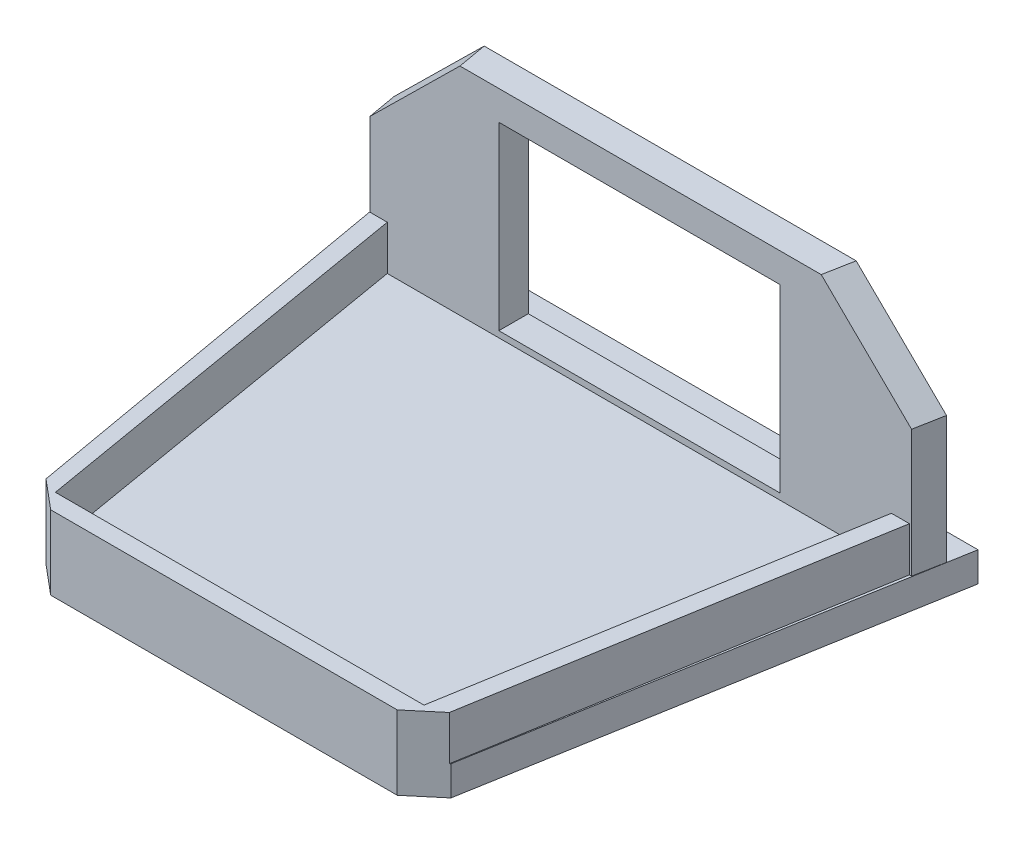
ISO-10303-21;
HEADER;
FILE_DESCRIPTION(('STEP AP214'),'2;1');
FILE_NAME('part.step','',(''),(''),'','','');
FILE_SCHEMA(('AUTOMOTIVE_DESIGN { 1 0 10303 214 1 1 1 1 }'));
ENDSEC;
DATA;
#1=APPLICATION_CONTEXT('core data for automotive mechanical design processes');
#2=APPLICATION_PROTOCOL_DEFINITION('international standard','automotive_design',2000,#1);
#3=PRODUCT_CONTEXT('',#1,'mechanical');
#4=PRODUCT('Part','Part','',(#3));
#5=PRODUCT_RELATED_PRODUCT_CATEGORY('part','',(#4));
#6=PRODUCT_DEFINITION_FORMATION('','',#4);
#7=PRODUCT_DEFINITION_CONTEXT('part definition',#1,'design');
#8=PRODUCT_DEFINITION('design','',#6,#7);
#9=PRODUCT_DEFINITION_SHAPE('','',#8);
#10=(LENGTH_UNIT() NAMED_UNIT(*) SI_UNIT(.MILLI.,.METRE.));
#11=(NAMED_UNIT(*) PLANE_ANGLE_UNIT() SI_UNIT($,.RADIAN.));
#12=(NAMED_UNIT(*) SI_UNIT($,.STERADIAN.) SOLID_ANGLE_UNIT());
#13=UNCERTAINTY_MEASURE_WITH_UNIT(LENGTH_MEASURE(1.E-05),#10,'distance_accuracy_value','');
#14=(GEOMETRIC_REPRESENTATION_CONTEXT(3) GLOBAL_UNCERTAINTY_ASSIGNED_CONTEXT((#13)) GLOBAL_UNIT_ASSIGNED_CONTEXT((#10,
#11,#12)) REPRESENTATION_CONTEXT('',''));
#15=CARTESIAN_POINT('',(0.,0.,0.));
#16=DIRECTION('',(0.,0.,1.));
#17=DIRECTION('',(1.,0.,0.));
#18=AXIS2_PLACEMENT_3D('',#15,#16,#17);
#19=CARTESIAN_POINT('',(-68.2447643049953,10.,151.736481776669));
#20=DIRECTION('',(0.642787609686541,0.,-0.766044443118976));
#21=DIRECTION('',(0.,1.,0.));
#22=AXIS2_PLACEMENT_3D('',#19,#20,#21);
#23=PLANE('',#22);
#24=DIRECTION('',(0.,1.,0.));
#25=VECTOR('',#24,1.);
#26=CARTESIAN_POINT('',(-68.2447643049953,10.,151.736481776669));
#27=LINE('',#26,#25);
#28=CARTESIAN_POINT('',(-68.2447643049953,0.,151.736481776669));
#29=VERTEX_POINT('',#28);
#30=CARTESIAN_POINT('',(-68.2447643049953,25.,151.736481776669));
#31=VERTEX_POINT('',#30);
#32=EDGE_CURVE('E381',#29,#31,#27,.T.);
#33=ORIENTED_EDGE('',*,*,#32,.F.);
#34=DIRECTION('',(0.766044443118977,0.,0.642787609686541));
#35=VECTOR('',#34,1.);
#36=CARTESIAN_POINT('',(-68.2447643049953,0.,151.736481776669));
#37=LINE('',#36,#35);
#38=CARTESIAN_POINT('',(-58.3966867748732,0.,160.));
#39=VERTEX_POINT('',#38);
#40=EDGE_CURVE('E90',#39,#29,#37,.F.);
#41=ORIENTED_EDGE('',*,*,#40,.F.);
#42=DIRECTION('',(0.,-1.,0.));
#43=VECTOR('',#42,1.);
#44=CARTESIAN_POINT('',(-58.3966867748732,10.,160.));
#45=LINE('',#44,#43);
#46=CARTESIAN_POINT('',(-58.3966867748732,25.,160.));
#47=VERTEX_POINT('',#46);
#48=EDGE_CURVE('E384',#47,#39,#45,.T.);
#49=ORIENTED_EDGE('',*,*,#48,.F.);
#50=DIRECTION('',(-0.766044443118977,0.,-0.642787609686541));
#51=VECTOR('',#50,1.);
#52=CARTESIAN_POINT('',(-68.2447643049953,25.,151.736481776669));
#53=LINE('',#52,#51);
#54=EDGE_CURVE('E14',#31,#47,#53,.F.);
#55=ORIENTED_EDGE('',*,*,#54,.F.);
#56=EDGE_LOOP('',(#33,#41,#49,#55));
#57=FACE_BOUND('',#56,.T.);
#58=ADVANCED_FACE('F82',(#57),#23,.F.);
#59=CARTESIAN_POINT('',(68.5777364082518,10.,151.715738587815));
#60=DIRECTION('',(-0.643593870860535,0.,-0.765367185990327));
#61=DIRECTION('',(0.,-1.,0.));
#62=AXIS2_PLACEMENT_3D('',#59,#60,#61);
#63=PLANE('',#62);
#64=DIRECTION('',(0.,-1.,0.));
#65=VECTOR('',#64,1.);
#66=CARTESIAN_POINT('',(68.5777364082518,10.,151.715738587815));
#67=LINE('',#66,#65);
#68=CARTESIAN_POINT('',(68.5777364082518,10.,151.715738587815));
#69=VERTEX_POINT('',#68);
#70=CARTESIAN_POINT('',(68.5777364082518,0.,151.715738587815));
#71=VERTEX_POINT('',#70);
#72=EDGE_CURVE('E364',#69,#71,#67,.T.);
#73=ORIENTED_EDGE('',*,*,#72,.F.);
#74=DIRECTION('',(-0.765367185990328,0.,0.643593870860535));
#75=VECTOR('',#74,1.);
#76=CARTESIAN_POINT('',(103.138787425222,10.,122.653504130717));
#77=LINE('',#76,#75);
#78=CARTESIAN_POINT('',(68.2903963516016,10.,151.95736156656));
#79=VERTEX_POINT('',#78);
#80=EDGE_CURVE('E376',#79,#69,#77,.F.);
#81=ORIENTED_EDGE('',*,*,#80,.F.);
#82=DIRECTION('',(0.,1.,0.));
#83=VECTOR('',#82,1.);
#84=CARTESIAN_POINT('',(68.2903963516016,25.,151.95736156656));
#85=LINE('',#84,#83);
#86=CARTESIAN_POINT('',(68.2903963516016,25.,151.95736156656));
#87=VERTEX_POINT('',#86);
#88=EDGE_CURVE('E373',#87,#79,#85,.F.);
#89=ORIENTED_EDGE('',*,*,#88,.F.);
#90=DIRECTION('',(-0.765367185990328,0.,0.643593870860535));
#91=VECTOR('',#90,1.);
#92=CARTESIAN_POINT('',(68.5777364082518,25.,151.715738587815));
#93=LINE('',#92,#91);
#94=CARTESIAN_POINT('',(58.7260238110288,25.,160.));
#95=VERTEX_POINT('',#94);
#96=EDGE_CURVE('E370',#95,#87,#93,.F.);
#97=ORIENTED_EDGE('',*,*,#96,.F.);
#98=DIRECTION('',(0.,1.,0.));
#99=VECTOR('',#98,1.);
#100=CARTESIAN_POINT('',(58.7260238110288,10.,160.));
#101=LINE('',#100,#99);
#102=CARTESIAN_POINT('',(58.7260238110288,0.,160.));
#103=VERTEX_POINT('',#102);
#104=EDGE_CURVE('E367',#103,#95,#101,.T.);
#105=ORIENTED_EDGE('',*,*,#104,.F.);
#106=DIRECTION('',(0.765367185990328,0.,-0.643593870860535));
#107=VECTOR('',#106,1.);
#108=CARTESIAN_POINT('',(68.5777364082518,0.,151.715738587815));
#109=LINE('',#108,#107);
#110=EDGE_CURVE('E378',#71,#103,#109,.F.);
#111=ORIENTED_EDGE('',*,*,#110,.F.);
#112=EDGE_LOOP('',(#73,#81,#89,#97,#105,#111));
#113=FACE_BOUND('',#112,.T.);
#114=ADVANCED_FACE('F538',(#113),#63,.F.);
#115=CARTESIAN_POINT('',(0.,10.,0.));
#116=DIRECTION('',(0.,1.,0.));
#117=DIRECTION('',(0.,0.,1.));
#118=AXIS2_PLACEMENT_3D('',#115,#116,#117);
#119=PLANE('',#118);
#120=DIRECTION('',(0.,0.,1.));
#121=VECTOR('',#120,1.);
#122=CARTESIAN_POINT('',(-62.7317504692542,10.,154.));
#123=LINE('',#122,#121);
#124=CARTESIAN_POINT('',(-62.7317504692542,10.,154.));
#125=VERTEX_POINT('',#124);
#126=CARTESIAN_POINT('',(-62.7317504692542,10.,154.085266054807));
#127=VERTEX_POINT('',#126);
#128=EDGE_CURVE('E285',#125,#127,#123,.T.);
#129=ORIENTED_EDGE('',*,*,#128,.T.);
#130=DIRECTION('',(-1.,0.,0.));
#131=VECTOR('',#130,1.);
#132=CARTESIAN_POINT('',(0.,10.,154.085266054807));
#133=LINE('',#132,#131);
#134=CARTESIAN_POINT('',(61.8455102774302,10.,154.085266054807));
#135=VERTEX_POINT('',#134);
#136=EDGE_CURVE('E257',#135,#127,#133,.T.);
#137=ORIENTED_EDGE('',*,*,#136,.F.);
#138=DIRECTION('',(-0.166695453989016,0.,0.986008430805435));
#139=VECTOR('',#138,1.);
#140=CARTESIAN_POINT('',(85.5456875547142,10.,13.898032103453));
#141=LINE('',#140,#139);
#142=CARTESIAN_POINT('',(84.6909741974674,10.,18.9536863279701));
#143=VERTEX_POINT('',#142);
#144=EDGE_CURVE('E265',#143,#135,#141,.T.);
#145=ORIENTED_EDGE('',*,*,#144,.F.);
#146=DIRECTION('',(-1.,0.,0.));
#147=VECTOR('',#146,1.);
#148=CARTESIAN_POINT('',(91.5012770182299,10.,18.9536863279701));
#149=LINE('',#148,#147);
#150=CARTESIAN_POINT('',(-85.6827631120349,10.,18.9536863279701));
#151=VERTEX_POINT('',#150);
#152=EDGE_CURVE('E344',#143,#151,#149,.T.);
#153=ORIENTED_EDGE('',*,*,#152,.T.);
#154=DIRECTION('',(0.16754681621269,0.,0.985864120645939));
#155=VECTOR('',#154,1.);
#156=CARTESIAN_POINT('',(-86.3438606705436,10.,15.0637146895178));
#157=LINE('',#156,#155);
#158=EDGE_CURVE('E287',#151,#125,#157,.T.);
#159=ORIENTED_EDGE('',*,*,#158,.T.);
#160=EDGE_LOOP('',(#129,#137,#145,#153,#159));
#161=FACE_BOUND('',#160,.T.);
#162=ADVANCED_FACE('F554',(#161),#119,.T.);
#163=CARTESIAN_POINT('',(-62.7317504692542,25.,154.));
#164=DIRECTION('',(1.,0.,0.));
#165=DIRECTION('',(0.,0.,-1.));
#166=AXIS2_PLACEMENT_3D('',#163,#164,#165);
#167=PLANE('',#166);
#168=DIRECTION('',(0.,0.,1.));
#169=VECTOR('',#168,1.);
#170=CARTESIAN_POINT('',(-62.7317504692542,25.,154.));
#171=LINE('',#170,#169);
#172=CARTESIAN_POINT('',(-62.7317504692542,25.,154.));
#173=VERTEX_POINT('',#172);
#174=CARTESIAN_POINT('',(-62.7317504692542,25.,154.085266054807));
#175=VERTEX_POINT('',#174);
#176=EDGE_CURVE('E250',#173,#175,#171,.T.);
#177=ORIENTED_EDGE('',*,*,#176,.T.);
#178=DIRECTION('',(0.,-1.,0.));
#179=VECTOR('',#178,1.);
#180=CARTESIAN_POINT('',(-62.7317504692542,25.,154.085266054807));
#181=LINE('',#180,#179);
#182=EDGE_CURVE('E256',#175,#127,#181,.T.);
#183=ORIENTED_EDGE('',*,*,#182,.T.);
#184=ORIENTED_EDGE('',*,*,#128,.F.);
#185=DIRECTION('',(0.,-1.,0.));
#186=VECTOR('',#185,1.);
#187=CARTESIAN_POINT('',(-62.7317504692542,25.,154.));
#188=LINE('',#187,#186);
#189=EDGE_CURVE('E270',#173,#125,#188,.T.);
#190=ORIENTED_EDGE('',*,*,#189,.F.);
#191=EDGE_LOOP('',(#177,#183,#184,#190));
#192=FACE_BOUND('',#191,.T.);
#193=ADVANCED_FACE('F268',(#192),#167,.T.);
#194=CARTESIAN_POINT('',(85.5456875547142,25.,13.898032103453));
#195=DIRECTION('',(0.986008430805435,0.,0.166695453989016));
#196=DIRECTION('',(0.166695453989016,0.,-0.986008430805435));
#197=AXIS2_PLACEMENT_3D('',#194,#195,#196);
#198=PLANE('',#197);
#199=DIRECTION('',(0.,-1.,0.));
#200=VECTOR('',#199,1.);
#201=CARTESIAN_POINT('',(61.8455102774302,25.,154.085266054807));
#202=LINE('',#201,#200);
#203=CARTESIAN_POINT('',(61.8455102774302,25.,154.085266054807));
#204=VERTEX_POINT('',#203);
#205=EDGE_CURVE('E362',#204,#135,#202,.T.);
#206=ORIENTED_EDGE('',*,*,#205,.F.);
#207=DIRECTION('',(-0.166695453989016,0.,0.986008430805435));
#208=VECTOR('',#207,1.);
#209=CARTESIAN_POINT('',(85.5456875547142,25.,13.898032103453));
#210=LINE('',#209,#208);
#211=CARTESIAN_POINT('',(84.6909741974674,25.,18.9536863279701));
#212=VERTEX_POINT('',#211);
#213=EDGE_CURVE('E253',#212,#204,#210,.T.);
#214=ORIENTED_EDGE('',*,*,#213,.F.);
#215=DIRECTION('',(0.,-1.,0.));
#216=VECTOR('',#215,1.);
#217=CARTESIAN_POINT('',(84.6909741974674,10.,18.9536863279701));
#218=LINE('',#217,#216);
#219=EDGE_CURVE('E288',#212,#143,#218,.T.);
#220=ORIENTED_EDGE('',*,*,#219,.T.);
#221=ORIENTED_EDGE('',*,*,#144,.T.);
#222=EDGE_LOOP('',(#206,#214,#220,#221));
#223=FACE_BOUND('',#222,.T.);
#224=ADVANCED_FACE('F518',(#223),#198,.F.);
#225=CARTESIAN_POINT('',(91.5012770182299,10.,18.9536863279701));
#226=DIRECTION('',(0.,0.,-1.));
#227=DIRECTION('',(-1.,0.,0.));
#228=AXIS2_PLACEMENT_3D('',#225,#226,#227);
#229=PLANE('',#228);
#230=DIRECTION('',(-1.,0.,0.));
#231=VECTOR('',#230,1.);
#232=CARTESIAN_POINT('',(91.5012770182299,73.109439340653,18.9536863279701));
#233=LINE('',#232,#231);
#234=CARTESIAN_POINT('',(47.0304394550277,73.109439340653,18.9536863279701));
#235=VERTEX_POINT('',#234);
#236=CARTESIAN_POINT('',(-47.9695605449723,73.109439340653,18.9536863279701));
#237=VERTEX_POINT('',#236);
#238=EDGE_CURVE('E421',#235,#237,#233,.T.);
#239=ORIENTED_EDGE('',*,*,#238,.F.);
#240=DIRECTION('',(0.,-1.,0.));
#241=VECTOR('',#240,1.);
#242=CARTESIAN_POINT('',(47.0304394550277,10.,18.9536863279701));
#243=LINE('',#242,#241);
#244=CARTESIAN_POINT('',(47.0304394550277,12.109439340653,18.9536863279701));
#245=VERTEX_POINT('',#244);
#246=EDGE_CURVE('E412',#235,#245,#243,.T.);
#247=ORIENTED_EDGE('',*,*,#246,.T.);
#248=DIRECTION('',(1.,0.,0.));
#249=VECTOR('',#248,1.);
#250=CARTESIAN_POINT('',(91.5012770182299,12.109439340653,18.9536863279701));
#251=LINE('',#250,#249);
#252=CARTESIAN_POINT('',(-47.9695605449723,12.109439340653,18.9536863279701));
#253=VERTEX_POINT('',#252);
#254=EDGE_CURVE('E415',#253,#245,#251,.T.);
#255=ORIENTED_EDGE('',*,*,#254,.F.);
#256=DIRECTION('',(0.,1.,0.));
#257=VECTOR('',#256,1.);
#258=CARTESIAN_POINT('',(-47.9695605449723,10.,18.9536863279701));
#259=LINE('',#258,#257);
#260=EDGE_CURVE('E418',#253,#237,#259,.T.);
#261=ORIENTED_EDGE('',*,*,#260,.T.);
#262=EDGE_LOOP('',(#239,#247,#255,#261));
#263=FACE_BOUND('',#262,.T.);
#264=ORIENTED_EDGE('',*,*,#219,.F.);
#265=DIRECTION('',(-1.,0.,0.));
#266=VECTOR('',#265,1.);
#267=CARTESIAN_POINT('',(91.5012770182299,25.,18.9536863279701));
#268=LINE('',#267,#266);
#269=CARTESIAN_POINT('',(90.7761148641642,25.,18.9536863279701));
#270=VERTEX_POINT('',#269);
#271=EDGE_CURVE('E360',#270,#212,#268,.T.);
#272=ORIENTED_EDGE('',*,*,#271,.F.);
#273=DIRECTION('',(0.,-1.,0.));
#274=VECTOR('',#273,1.);
#275=CARTESIAN_POINT('',(90.7761148641642,10.,18.9536863279701));
#276=LINE('',#275,#274);
#277=CARTESIAN_POINT('',(90.7761148641642,10.,18.9536863279701));
#278=VERTEX_POINT('',#277);
#279=EDGE_CURVE('E519',#270,#278,#276,.T.);
#280=ORIENTED_EDGE('',*,*,#279,.T.);
#281=CARTESIAN_POINT('',(91.5012770182299,10.,18.9536863279701));
#282=VERTEX_POINT('',#281);
#283=EDGE_CURVE('E338',#282,#278,#149,.T.);
#284=ORIENTED_EDGE('',*,*,#283,.F.);
#285=DIRECTION('',(0.,1.,0.));
#286=VECTOR('',#285,1.);
#287=CARTESIAN_POINT('',(91.5012770182299,10.,18.9536863279701));
#288=LINE('',#287,#286);
#289=CARTESIAN_POINT('',(91.5012770182299,52.9999999999995,18.9536863279701));
#290=VERTEX_POINT('',#289);
#291=EDGE_CURVE('E341',#282,#290,#288,.T.);
#292=ORIENTED_EDGE('',*,*,#291,.T.);
#293=DIRECTION('',(-0.713234835358278,0.700925152660004,0.));
#294=VECTOR('',#293,1.);
#295=CARTESIAN_POINT('',(92.4528851183413,52.0648156542881,18.9536863279701));
#296=LINE('',#295,#294);
#297=CARTESIAN_POINT('',(60.9744155130504,83.,18.9536863279701));
#298=VERTEX_POINT('',#297);
#299=EDGE_CURVE('E439',#290,#298,#296,.T.);
#300=ORIENTED_EDGE('',*,*,#299,.T.);
#301=DIRECTION('',(-1.,0.,0.));
#302=VECTOR('',#301,1.);
#303=CARTESIAN_POINT('',(91.5012770182299,83.,18.9536863279701));
#304=LINE('',#303,#302);
#305=CARTESIAN_POINT('',(-61.1252552134228,83.,18.9536863279701));
#306=VERTEX_POINT('',#305);
#307=EDGE_CURVE('E345',#298,#306,#304,.T.);
#308=ORIENTED_EDGE('',*,*,#307,.T.);
#309=DIRECTION('',(-0.71250691141033,-0.701665091901052,0.));
#310=VECTOR('',#309,1.);
#311=CARTESIAN_POINT('',(-91.5888019810089,52.9999999999995,18.9536863279701));
#312=LINE('',#311,#310);
#313=CARTESIAN_POINT('',(-91.5888019810089,52.9999999999995,18.9536863279701));
#314=VERTEX_POINT('',#313);
#315=EDGE_CURVE('E433',#306,#314,#312,.T.);
#316=ORIENTED_EDGE('',*,*,#315,.T.);
#317=DIRECTION('',(0.,1.,0.));
#318=VECTOR('',#317,1.);
#319=CARTESIAN_POINT('',(-91.5888019810089,10.,18.9536863279701));
#320=LINE('',#319,#318);
#321=CARTESIAN_POINT('',(-91.5888019810089,25.,18.9536863279701));
#322=VERTEX_POINT('',#321);
#323=EDGE_CURVE('E325',#322,#314,#320,.T.);
#324=ORIENTED_EDGE('',*,*,#323,.F.);
#325=DIRECTION('',(-1.,0.,0.));
#326=VECTOR('',#325,1.);
#327=CARTESIAN_POINT('',(91.5012770182299,25.,18.9536863279701));
#328=LINE('',#327,#326);
#329=CARTESIAN_POINT('',(-85.6827631120349,25.,18.9536863279701));
#330=VERTEX_POINT('',#329);
#331=EDGE_CURVE('E294',#330,#322,#328,.T.);
#332=ORIENTED_EDGE('',*,*,#331,.F.);
#333=DIRECTION('',(0.,-1.,0.));
#334=VECTOR('',#333,1.);
#335=CARTESIAN_POINT('',(-85.682763112035,10.,18.9536863279701));
#336=LINE('',#335,#334);
#337=EDGE_CURVE('E297',#330,#151,#336,.T.);
#338=ORIENTED_EDGE('',*,*,#337,.T.);
#339=ORIENTED_EDGE('',*,*,#152,.F.);
#340=EDGE_LOOP('',(#264,#272,#280,#284,#292,#300,#308,#316,#324,#332,#338,#339));
#341=FACE_BOUND('',#340,.T.);
#342=ADVANCED_FACE('F465',(#263,#341),#229,.F.);
#343=CARTESIAN_POINT('',(-93.3425383698904,10.,9.01584679097305));
#344=DIRECTION('',(0.,0.,1.));
#345=DIRECTION('',(1.,0.,0.));
#346=AXIS2_PLACEMENT_3D('',#343,#344,#345);
#347=PLANE('',#346);
#348=DIRECTION('',(1.,0.,0.));
#349=VECTOR('',#348,1.);
#350=CARTESIAN_POINT('',(-93.3425383698904,83.,9.01584679097305));
#351=LINE('',#350,#349);
#352=CARTESIAN_POINT('',(-62.8789916023044,83.,9.01584679097305));
#353=VERTEX_POINT('',#352);
#354=CARTESIAN_POINT('',(62.8450676611908,83.,9.01584679097305));
#355=VERTEX_POINT('',#354);
#356=EDGE_CURVE('E321',#353,#355,#351,.T.);
#357=ORIENTED_EDGE('',*,*,#356,.T.);
#358=DIRECTION('',(0.713234835358278,-0.700925152660004,0.));
#359=VECTOR('',#358,1.);
#360=CARTESIAN_POINT('',(93.3719291663704,52.9999999999995,9.01584679097305));
#361=LINE('',#360,#359);
#362=CARTESIAN_POINT('',(93.3719291663704,52.9999999999995,9.01584679097305));
#363=VERTEX_POINT('',#362);
#364=EDGE_CURVE('E452',#355,#363,#361,.T.);
#365=ORIENTED_EDGE('',*,*,#364,.T.);
#366=DIRECTION('',(0.,1.,0.));
#367=VECTOR('',#366,1.);
#368=CARTESIAN_POINT('',(93.3719291663704,10.,9.01584679097305));
#369=LINE('',#368,#367);
#370=CARTESIAN_POINT('',(93.3719291663703,10.,9.01584679097305));
#371=VERTEX_POINT('',#370);
#372=EDGE_CURVE('E322',#371,#363,#369,.T.);
#373=ORIENTED_EDGE('',*,*,#372,.F.);
#374=DIRECTION('',(1.,0.,0.));
#375=VECTOR('',#374,1.);
#376=CARTESIAN_POINT('',(-93.3425383698904,10.,9.01584679097305));
#377=LINE('',#376,#375);
#378=CARTESIAN_POINT('',(-93.3425383698904,10.,9.01584679097305));
#379=VERTEX_POINT('',#378);
#380=EDGE_CURVE('E326',#379,#371,#377,.T.);
#381=ORIENTED_EDGE('',*,*,#380,.F.);
#382=DIRECTION('',(0.,1.,0.));
#383=VECTOR('',#382,1.);
#384=CARTESIAN_POINT('',(-93.3425383698904,10.,9.01584679097305));
#385=LINE('',#384,#383);
#386=CARTESIAN_POINT('',(-93.3425383698904,52.9999999999995,9.01584679097305));
#387=VERTEX_POINT('',#386);
#388=EDGE_CURVE('E331',#379,#387,#385,.T.);
#389=ORIENTED_EDGE('',*,*,#388,.T.);
#390=DIRECTION('',(0.71250691141033,0.701665091901052,0.));
#391=VECTOR('',#390,1.);
#392=CARTESIAN_POINT('',(-92.4522258590102,53.8767651229242,9.01584679097305));
#393=LINE('',#392,#391);
#394=EDGE_CURVE('E426',#387,#353,#393,.T.);
#395=ORIENTED_EDGE('',*,*,#394,.T.);
#396=EDGE_LOOP('',(#357,#365,#373,#381,#389,#395));
#397=FACE_BOUND('',#396,.T.);
#398=DIRECTION('',(-1.,0.,0.));
#399=VECTOR('',#398,1.);
#400=CARTESIAN_POINT('',(47.0304394550277,73.109439340653,9.01584679097305));
#401=LINE('',#400,#399);
#402=CARTESIAN_POINT('',(47.0304394550277,73.109439340653,9.01584679097305));
#403=VERTEX_POINT('',#402);
#404=CARTESIAN_POINT('',(-47.9695605449723,73.109439340653,9.01584679097305));
#405=VERTEX_POINT('',#404);
#406=EDGE_CURVE('E300',#403,#405,#401,.T.);
#407=ORIENTED_EDGE('',*,*,#406,.T.);
#408=DIRECTION('',(0.,1.,0.));
#409=VECTOR('',#408,1.);
#410=CARTESIAN_POINT('',(-47.9695605449723,12.109439340653,9.01584679097305));
#411=LINE('',#410,#409);
#412=CARTESIAN_POINT('',(-47.9695605449723,12.109439340653,9.01584679097305));
#413=VERTEX_POINT('',#412);
#414=EDGE_CURVE('E303',#413,#405,#411,.T.);
#415=ORIENTED_EDGE('',*,*,#414,.F.);
#416=DIRECTION('',(1.,0.,0.));
#417=VECTOR('',#416,1.);
#418=CARTESIAN_POINT('',(-47.9695605449723,12.109439340653,9.01584679097305));
#419=LINE('',#418,#417);
#420=CARTESIAN_POINT('',(47.0304394550277,12.109439340653,9.01584679097305));
#421=VERTEX_POINT('',#420);
#422=EDGE_CURVE('E306',#413,#421,#419,.T.);
#423=ORIENTED_EDGE('',*,*,#422,.T.);
#424=DIRECTION('',(0.,-1.,0.));
#425=VECTOR('',#424,1.);
#426=CARTESIAN_POINT('',(47.0304394550277,73.109439340653,9.01584679097305));
#427=LINE('',#426,#425);
#428=EDGE_CURVE('E309',#403,#421,#427,.T.);
#429=ORIENTED_EDGE('',*,*,#428,.F.);
#430=EDGE_LOOP('',(#407,#415,#423,#429));
#431=FACE_BOUND('',#430,.T.);
#432=ADVANCED_FACE('F476',(#397,#431),#347,.F.);
#433=DIRECTION('',(-0.166695453989016,0.,0.986008430805435));
#434=VECTOR('',#433,1.);
#435=CARTESIAN_POINT('',(91.4617381395468,10.,14.8982048273871));
#436=LINE('',#435,#434);
#437=EDGE_CURVE('E523',#278,#79,#436,.T.);
#438=ORIENTED_EDGE('',*,*,#437,.T.);
#439=ORIENTED_EDGE('',*,*,#80,.T.);
#440=DIRECTION('',(0.171573858781503,0.,-0.985171259722301));
#441=VECTOR('',#440,1.);
#442=CARTESIAN_POINT('',(67.1349794422762,10.,160.));
#443=LINE('',#442,#441);
#444=CARTESIAN_POINT('',(95.,10.,0.));
#445=VERTEX_POINT('',#444);
#446=EDGE_CURVE('E402',#69,#445,#443,.T.);
#447=ORIENTED_EDGE('',*,*,#446,.T.);
#448=DIRECTION('',(-1.,0.,0.));
#449=VECTOR('',#448,1.);
#450=CARTESIAN_POINT('',(95.,10.,0.));
#451=LINE('',#450,#449);
#452=CARTESIAN_POINT('',(-95.,10.,0.));
#453=VERTEX_POINT('',#452);
#454=EDGE_CURVE('E490',#445,#453,#451,.T.);
#455=ORIENTED_EDGE('',*,*,#454,.T.);
#456=DIRECTION('',(0.173648177666928,0.,0.984807753012209));
#457=VECTOR('',#456,1.);
#458=CARTESIAN_POINT('',(-95.,10.,0.));
#459=LINE('',#458,#457);
#460=CARTESIAN_POINT('',(-92.3438606705436,10.,15.0637146895178));
#461=VERTEX_POINT('',#460);
#462=EDGE_CURVE('E409',#453,#461,#459,.T.);
#463=ORIENTED_EDGE('',*,*,#462,.T.);
#464=DIRECTION('',(1.,0.,0.));
#465=VECTOR('',#464,1.);
#466=CARTESIAN_POINT('',(-92.3438606705436,10.,15.0637146895178));
#467=LINE('',#466,#465);
#468=CARTESIAN_POINT('',(-92.2752675642651,10.,15.0637146895178));
#469=VERTEX_POINT('',#468);
#470=EDGE_CURVE('E276',#461,#469,#467,.T.);
#471=ORIENTED_EDGE('',*,*,#470,.T.);
#472=DIRECTION('',(-0.17378533390902,0.,-0.984783558817942));
#473=VECTOR('',#472,1.);
#474=CARTESIAN_POINT('',(-91.5888019810089,10.,18.9536863279701));
#475=LINE('',#474,#473);
#476=EDGE_CURVE('E441',#469,#379,#475,.T.);
#477=ORIENTED_EDGE('',*,*,#476,.T.);
#478=ORIENTED_EDGE('',*,*,#380,.T.);
#479=DIRECTION('',(-0.184986551027228,0.,0.982741052332226));
#480=VECTOR('',#479,1.);
#481=CARTESIAN_POINT('',(93.3719291663704,10.,9.01584679097305));
#482=LINE('',#481,#480);
#483=EDGE_CURVE('E334',#371,#282,#482,.T.);
#484=ORIENTED_EDGE('',*,*,#483,.T.);
#485=ORIENTED_EDGE('',*,*,#283,.T.);
#486=EDGE_LOOP('',(#438,#439,#447,#455,#463,#471,#477,#478,#484,#485));
#487=FACE_BOUND('',#486,.T.);
#488=ADVANCED_FACE('F482',(#487),#119,.T.);
#489=CARTESIAN_POINT('',(67.1349794422762,10.,160.));
#490=DIRECTION('',(-0.985171259722301,0.,-0.171573858781503));
#491=DIRECTION('',(-0.171573858781503,0.,0.985171259722301));
#492=AXIS2_PLACEMENT_3D('',#489,#490,#491);
#493=PLANE('',#492);
#494=ORIENTED_EDGE('',*,*,#446,.F.);
#495=ORIENTED_EDGE('',*,*,#72,.T.);
#496=DIRECTION('',(0.171573858781503,0.,-0.985171259722301));
#497=VECTOR('',#496,1.);
#498=CARTESIAN_POINT('',(67.1349794422762,0.,160.));
#499=LINE('',#498,#497);
#500=CARTESIAN_POINT('',(95.,0.,0.));
#501=VERTEX_POINT('',#500);
#502=EDGE_CURVE('E337',#71,#501,#499,.T.);
#503=ORIENTED_EDGE('',*,*,#502,.T.);
#504=DIRECTION('',(0.,-1.,0.));
#505=VECTOR('',#504,1.);
#506=CARTESIAN_POINT('',(95.,10.,0.));
#507=LINE('',#506,#505);
#508=EDGE_CURVE('E408',#445,#501,#507,.T.);
#509=ORIENTED_EDGE('',*,*,#508,.F.);
#510=EDGE_LOOP('',(#494,#495,#503,#509));
#511=FACE_BOUND('',#510,.T.);
#512=ADVANCED_FACE('F498',(#511),#493,.F.);
#513=CARTESIAN_POINT('',(95.,10.,0.));
#514=DIRECTION('',(0.,0.,1.));
#515=DIRECTION('',(1.,0.,0.));
#516=AXIS2_PLACEMENT_3D('',#513,#514,#515);
#517=PLANE('',#516);
#518=DIRECTION('',(-1.,0.,0.));
#519=VECTOR('',#518,1.);
#520=CARTESIAN_POINT('',(95.,0.,0.));
#521=LINE('',#520,#519);
#522=CARTESIAN_POINT('',(-95.,0.,0.));
#523=VERTEX_POINT('',#522);
#524=EDGE_CURVE('E400',#501,#523,#521,.T.);
#525=ORIENTED_EDGE('',*,*,#524,.T.);
#526=DIRECTION('',(0.,-1.,0.));
#527=VECTOR('',#526,1.);
#528=CARTESIAN_POINT('',(-95.,10.,0.));
#529=LINE('',#528,#527);
#530=EDGE_CURVE('E399',#453,#523,#529,.T.);
#531=ORIENTED_EDGE('',*,*,#530,.F.);
#532=ORIENTED_EDGE('',*,*,#454,.F.);
#533=ORIENTED_EDGE('',*,*,#508,.T.);
#534=EDGE_LOOP('',(#525,#531,#532,#533));
#535=FACE_BOUND('',#534,.T.);
#536=ADVANCED_FACE('F502',(#535),#517,.F.);
#537=CARTESIAN_POINT('',(-95.,10.,0.));
#538=DIRECTION('',(0.984807753012208,0.,-0.173648177666928));
#539=DIRECTION('',(-0.173648177666928,0.,-0.984807753012209));
#540=AXIS2_PLACEMENT_3D('',#537,#538,#539);
#541=PLANE('',#540);
#542=DIRECTION('',(0.173648177666928,0.,0.984807753012209));
#543=VECTOR('',#542,1.);
#544=CARTESIAN_POINT('',(-95.,0.,0.));
#545=LINE('',#544,#543);
#546=EDGE_CURVE('E391',#523,#29,#545,.T.);
#547=ORIENTED_EDGE('',*,*,#546,.T.);
#548=ORIENTED_EDGE('',*,*,#32,.T.);
#549=DIRECTION('',(0.173648177666928,0.,0.984807753012209));
#550=VECTOR('',#549,1.);
#551=CARTESIAN_POINT('',(-92.3438606705436,25.,15.0637146895178));
#552=LINE('',#551,#550);
#553=CARTESIAN_POINT('',(-92.3438606705436,25.,15.0637146895178));
#554=VERTEX_POINT('',#553);
#555=EDGE_CURVE('E282',#554,#31,#552,.T.);
#556=ORIENTED_EDGE('',*,*,#555,.F.);
#557=DIRECTION('',(0.,-1.,0.));
#558=VECTOR('',#557,1.);
#559=CARTESIAN_POINT('',(-92.3438606705436,25.,15.0637146895178));
#560=LINE('',#559,#558);
#561=EDGE_CURVE('E284',#554,#461,#560,.T.);
#562=ORIENTED_EDGE('',*,*,#561,.T.);
#563=ORIENTED_EDGE('',*,*,#462,.F.);
#564=ORIENTED_EDGE('',*,*,#530,.T.);
#565=EDGE_LOOP('',(#547,#548,#556,#562,#563,#564));
#566=FACE_BOUND('',#565,.T.);
#567=ADVANCED_FACE('F396',(#566),#541,.F.);
#568=CARTESIAN_POINT('',(-66.7876830866461,10.,160.));
#569=DIRECTION('',(0.,0.,-1.));
#570=DIRECTION('',(-1.,0.,0.));
#571=AXIS2_PLACEMENT_3D('',#568,#569,#570);
#572=PLANE('',#571);
#573=DIRECTION('',(1.,0.,0.));
#574=VECTOR('',#573,1.);
#575=CARTESIAN_POINT('',(-66.7876830866461,25.,160.));
#576=LINE('',#575,#574);
#577=EDGE_CURVE('E272',#47,#95,#576,.T.);
#578=ORIENTED_EDGE('',*,*,#577,.F.);
#579=ORIENTED_EDGE('',*,*,#48,.T.);
#580=DIRECTION('',(1.,0.,0.));
#581=VECTOR('',#580,1.);
#582=CARTESIAN_POINT('',(-66.7876830866461,0.,160.));
#583=LINE('',#582,#581);
#584=EDGE_CURVE('E392',#39,#103,#583,.T.);
#585=ORIENTED_EDGE('',*,*,#584,.T.);
#586=ORIENTED_EDGE('',*,*,#104,.T.);
#587=EDGE_LOOP('',(#578,#579,#585,#586));
#588=FACE_BOUND('',#587,.T.);
#589=ADVANCED_FACE('F540',(#588),#572,.F.);
#590=CARTESIAN_POINT('',(0.,0.,0.));
#591=DIRECTION('',(0.,1.,0.));
#592=DIRECTION('',(0.,0.,1.));
#593=AXIS2_PLACEMENT_3D('',#590,#591,#592);
#594=PLANE('',#593);
#595=ORIENTED_EDGE('',*,*,#584,.F.);
#596=ORIENTED_EDGE('',*,*,#40,.T.);
#597=ORIENTED_EDGE('',*,*,#546,.F.);
#598=ORIENTED_EDGE('',*,*,#524,.F.);
#599=ORIENTED_EDGE('',*,*,#502,.F.);
#600=ORIENTED_EDGE('',*,*,#110,.T.);
#601=EDGE_LOOP('',(#595,#596,#597,#598,#599,#600));
#602=FACE_BOUND('',#601,.T.);
#603=ADVANCED_FACE('F388',(#602),#594,.F.);
#604=CARTESIAN_POINT('',(0.,83.,0.));
#605=DIRECTION('',(0.,1.,0.));
#606=DIRECTION('',(0.,0.,1.));
#607=AXIS2_PLACEMENT_3D('',#604,#605,#606);
#608=PLANE('',#607);
#609=ORIENTED_EDGE('',*,*,#307,.F.);
#610=DIRECTION('',(0.184986551027228,0.,-0.982741052332226));
#611=VECTOR('',#610,1.);
#612=CARTESIAN_POINT('',(63.8896975964034,83.,3.46625026015617));
#613=LINE('',#612,#611);
#614=EDGE_CURVE('E456',#298,#355,#613,.T.);
#615=ORIENTED_EDGE('',*,*,#614,.T.);
#616=ORIENTED_EDGE('',*,*,#356,.F.);
#617=DIRECTION('',(0.17378533390902,0.,0.984783558817942));
#618=VECTOR('',#617,1.);
#619=CARTESIAN_POINT('',(-62.0452952164704,83.,13.7401263106994));
#620=LINE('',#619,#618);
#621=EDGE_CURVE('E430',#353,#306,#620,.T.);
#622=ORIENTED_EDGE('',*,*,#621,.T.);
#623=EDGE_LOOP('',(#609,#615,#616,#622));
#624=FACE_BOUND('',#623,.T.);
#625=ADVANCED_FACE('F469',(#624),#608,.T.);
#626=CARTESIAN_POINT('',(-91.5888019810089,10.,18.9536863279701));
#627=DIRECTION('',(0.984783558817942,0.,-0.17378533390902));
#628=DIRECTION('',(-0.17378533390902,0.,-0.984783558817942));
#629=AXIS2_PLACEMENT_3D('',#626,#627,#628);
#630=PLANE('',#629);
#631=ORIENTED_EDGE('',*,*,#476,.F.);
#632=DIRECTION('',(0.,1.,0.));
#633=VECTOR('',#632,1.);
#634=CARTESIAN_POINT('',(-92.2752675642651,10.,15.0637146895178));
#635=LINE('',#634,#633);
#636=CARTESIAN_POINT('',(-92.2752675642651,25.,15.0637146895178));
#637=VERTEX_POINT('',#636);
#638=EDGE_CURVE('E358',#469,#637,#635,.T.);
#639=ORIENTED_EDGE('',*,*,#638,.T.);
#640=DIRECTION('',(-0.17378533390902,0.,-0.984783558817942));
#641=VECTOR('',#640,1.);
#642=CARTESIAN_POINT('',(-91.5888019810089,25.,18.9536863279701));
#643=LINE('',#642,#641);
#644=EDGE_CURVE('E453',#322,#637,#643,.T.);
#645=ORIENTED_EDGE('',*,*,#644,.F.);
#646=ORIENTED_EDGE('',*,*,#323,.T.);
#647=DIRECTION('',(-0.17378533390902,0.,-0.984783558817942));
#648=VECTOR('',#647,1.);
#649=CARTESIAN_POINT('',(-93.3425383698904,52.9999999999995,9.01584679097305));
#650=LINE('',#649,#648);
#651=EDGE_CURVE('E423',#314,#387,#650,.T.);
#652=ORIENTED_EDGE('',*,*,#651,.T.);
#653=ORIENTED_EDGE('',*,*,#388,.F.);
#654=EDGE_LOOP('',(#631,#639,#645,#646,#652,#653));
#655=FACE_BOUND('',#654,.T.);
#656=ADVANCED_FACE('F487',(#655),#630,.F.);
#657=CARTESIAN_POINT('',(93.3719291663704,10.,9.01584679097305));
#658=DIRECTION('',(-0.982741052332226,0.,-0.184986551027228));
#659=DIRECTION('',(-0.184986551027228,0.,0.982741052332226));
#660=AXIS2_PLACEMENT_3D('',#657,#658,#659);
#661=PLANE('',#660);
#662=ORIENTED_EDGE('',*,*,#372,.T.);
#663=DIRECTION('',(-0.184986551027228,0.,0.982741052332226));
#664=VECTOR('',#663,1.);
#665=CARTESIAN_POINT('',(91.5012770182299,52.9999999999995,18.9536863279701));
#666=LINE('',#665,#664);
#667=EDGE_CURVE('E436',#363,#290,#666,.T.);
#668=ORIENTED_EDGE('',*,*,#667,.T.);
#669=ORIENTED_EDGE('',*,*,#291,.F.);
#670=ORIENTED_EDGE('',*,*,#483,.F.);
#671=EDGE_LOOP('',(#662,#668,#669,#670));
#672=FACE_BOUND('',#671,.T.);
#673=ADVANCED_FACE('F474',(#672),#661,.F.);
#674=CARTESIAN_POINT('',(47.0304394550277,73.109439340653,82.015846790973));
#675=DIRECTION('',(0.,-1.,0.));
#676=DIRECTION('',(0.,0.,-1.));
#677=AXIS2_PLACEMENT_3D('',#674,#675,#676);
#678=PLANE('',#677);
#679=ORIENTED_EDGE('',*,*,#238,.T.);
#680=DIRECTION('',(0.,0.,-1.));
#681=VECTOR('',#680,1.);
#682=CARTESIAN_POINT('',(-47.9695605449723,73.109439340653,82.015846790973));
#683=LINE('',#682,#681);
#684=EDGE_CURVE('E319',#237,#405,#683,.T.);
#685=ORIENTED_EDGE('',*,*,#684,.T.);
#686=ORIENTED_EDGE('',*,*,#406,.F.);
#687=DIRECTION('',(0.,0.,-1.));
#688=VECTOR('',#687,1.);
#689=CARTESIAN_POINT('',(47.0304394550277,73.109439340653,82.015846790973));
#690=LINE('',#689,#688);
#691=EDGE_CURVE('E312',#235,#403,#690,.T.);
#692=ORIENTED_EDGE('',*,*,#691,.F.);
#693=EDGE_LOOP('',(#679,#685,#686,#692));
#694=FACE_BOUND('',#693,.T.);
#695=ADVANCED_FACE('F587',(#694),#678,.T.);
#696=CARTESIAN_POINT('',(-47.9695605449723,12.109439340653,82.015846790973));
#697=DIRECTION('',(-1.,0.,0.));
#698=DIRECTION('',(0.,0.,1.));
#699=AXIS2_PLACEMENT_3D('',#696,#697,#698);
#700=PLANE('',#699);
#701=DIRECTION('',(0.,0.,-1.));
#702=VECTOR('',#701,1.);
#703=CARTESIAN_POINT('',(-47.9695605449723,12.109439340653,82.015846790973));
#704=LINE('',#703,#702);
#705=EDGE_CURVE('E317',#253,#413,#704,.T.);
#706=ORIENTED_EDGE('',*,*,#705,.T.);
#707=ORIENTED_EDGE('',*,*,#414,.T.);
#708=ORIENTED_EDGE('',*,*,#684,.F.);
#709=ORIENTED_EDGE('',*,*,#260,.F.);
#710=EDGE_LOOP('',(#706,#707,#708,#709));
#711=FACE_BOUND('',#710,.T.);
#712=ADVANCED_FACE('F591',(#711),#700,.F.);
#713=CARTESIAN_POINT('',(-47.9695605449723,12.109439340653,82.015846790973));
#714=DIRECTION('',(0.,1.,0.));
#715=DIRECTION('',(0.,0.,1.));
#716=AXIS2_PLACEMENT_3D('',#713,#714,#715);
#717=PLANE('',#716);
#718=ORIENTED_EDGE('',*,*,#254,.T.);
#719=DIRECTION('',(0.,0.,-1.));
#720=VECTOR('',#719,1.);
#721=CARTESIAN_POINT('',(47.0304394550277,12.109439340653,82.015846790973));
#722=LINE('',#721,#720);
#723=EDGE_CURVE('E315',#245,#421,#722,.T.);
#724=ORIENTED_EDGE('',*,*,#723,.T.);
#725=ORIENTED_EDGE('',*,*,#422,.F.);
#726=ORIENTED_EDGE('',*,*,#705,.F.);
#727=EDGE_LOOP('',(#718,#724,#725,#726));
#728=FACE_BOUND('',#727,.T.);
#729=ADVANCED_FACE('F601',(#728),#717,.T.);
#730=CARTESIAN_POINT('',(47.0304394550277,73.109439340653,82.015846790973));
#731=DIRECTION('',(1.,0.,0.));
#732=DIRECTION('',(0.,1.,0.));
#733=AXIS2_PLACEMENT_3D('',#730,#731,#732);
#734=PLANE('',#733);
#735=ORIENTED_EDGE('',*,*,#691,.T.);
#736=ORIENTED_EDGE('',*,*,#428,.T.);
#737=ORIENTED_EDGE('',*,*,#723,.F.);
#738=ORIENTED_EDGE('',*,*,#246,.F.);
#739=EDGE_LOOP('',(#735,#736,#737,#738));
#740=FACE_BOUND('',#739,.T.);
#741=ADVANCED_FACE('F575',(#740),#734,.F.);
#742=CARTESIAN_POINT('',(-91.5888019810089,52.9999999999995,18.9536863279701));
#743=DIRECTION('',(-0.696347132441192,0.707106781186544,0.122884788077837));
#744=DIRECTION('',(0.17378533390902,0.,0.984783558817942));
#745=AXIS2_PLACEMENT_3D('',#742,#743,#744);
#746=PLANE('',#745);
#747=ORIENTED_EDGE('',*,*,#315,.F.);
#748=ORIENTED_EDGE('',*,*,#621,.F.);
#749=ORIENTED_EDGE('',*,*,#394,.F.);
#750=ORIENTED_EDGE('',*,*,#651,.F.);
#751=EDGE_LOOP('',(#747,#748,#749,#750));
#752=FACE_BOUND('',#751,.T.);
#753=ADVANCED_FACE('F507',(#752),#746,.T.);
#754=CARTESIAN_POINT('',(93.3719291663704,52.9999999999995,9.01584679097305));
#755=DIRECTION('',(0.694902862254524,0.707106781186544,0.130805244659665));
#756=DIRECTION('',(0.184986551027228,0.,-0.982741052332226));
#757=AXIS2_PLACEMENT_3D('',#754,#755,#756);
#758=PLANE('',#757);
#759=ORIENTED_EDGE('',*,*,#364,.F.);
#760=ORIENTED_EDGE('',*,*,#614,.F.);
#761=ORIENTED_EDGE('',*,*,#299,.F.);
#762=ORIENTED_EDGE('',*,*,#667,.F.);
#763=EDGE_LOOP('',(#759,#760,#761,#762));
#764=FACE_BOUND('',#763,.T.);
#765=ADVANCED_FACE('F472',(#764),#758,.T.);
#766=CARTESIAN_POINT('',(-86.3438606705436,25.,15.0637146895178));
#767=DIRECTION('',(0.985864120645939,0.,-0.16754681621269));
#768=DIRECTION('',(-0.16754681621269,0.,-0.985864120645939));
#769=AXIS2_PLACEMENT_3D('',#766,#767,#768);
#770=PLANE('',#769);
#771=ORIENTED_EDGE('',*,*,#337,.F.);
#772=DIRECTION('',(0.16754681621269,0.,0.985864120645939));
#773=VECTOR('',#772,1.);
#774=CARTESIAN_POINT('',(-86.3438606705436,25.,15.0637146895178));
#775=LINE('',#774,#773);
#776=EDGE_CURVE('E271',#330,#173,#775,.T.);
#777=ORIENTED_EDGE('',*,*,#776,.T.);
#778=ORIENTED_EDGE('',*,*,#189,.T.);
#779=ORIENTED_EDGE('',*,*,#158,.F.);
#780=EDGE_LOOP('',(#771,#777,#778,#779));
#781=FACE_BOUND('',#780,.T.);
#782=ADVANCED_FACE('F511',(#781),#770,.T.);
#783=CARTESIAN_POINT('',(-92.3438606705436,25.,15.0637146895178));
#784=DIRECTION('',(0.,0.,-1.));
#785=DIRECTION('',(-1.,0.,0.));
#786=AXIS2_PLACEMENT_3D('',#783,#784,#785);
#787=PLANE('',#786);
#788=ORIENTED_EDGE('',*,*,#638,.F.);
#789=ORIENTED_EDGE('',*,*,#470,.F.);
#790=ORIENTED_EDGE('',*,*,#561,.F.);
#791=DIRECTION('',(1.,0.,0.));
#792=VECTOR('',#791,1.);
#793=CARTESIAN_POINT('',(-92.3438606705436,25.,15.0637146895178));
#794=LINE('',#793,#792);
#795=EDGE_CURVE('E274',#554,#637,#794,.T.);
#796=ORIENTED_EDGE('',*,*,#795,.T.);
#797=EDGE_LOOP('',(#788,#789,#790,#796));
#798=FACE_BOUND('',#797,.T.);
#799=ADVANCED_FACE('F489',(#798),#787,.T.);
#800=CARTESIAN_POINT('',(0.,25.,0.));
#801=DIRECTION('',(0.,-1.,0.));
#802=DIRECTION('',(0.,0.,-1.));
#803=AXIS2_PLACEMENT_3D('',#800,#801,#802);
#804=PLANE('',#803);
#805=ORIENTED_EDGE('',*,*,#555,.T.);
#806=ORIENTED_EDGE('',*,*,#54,.T.);
#807=ORIENTED_EDGE('',*,*,#577,.T.);
#808=ORIENTED_EDGE('',*,*,#96,.T.);
#809=DIRECTION('',(-0.166695453989016,0.,0.986008430805435));
#810=VECTOR('',#809,1.);
#811=CARTESIAN_POINT('',(91.4617381395468,25.,14.8982048273871));
#812=LINE('',#811,#810);
#813=EDGE_CURVE('E520',#270,#87,#812,.T.);
#814=ORIENTED_EDGE('',*,*,#813,.F.);
#815=ORIENTED_EDGE('',*,*,#271,.T.);
#816=ORIENTED_EDGE('',*,*,#213,.T.);
#817=DIRECTION('',(-1.,0.,0.));
#818=VECTOR('',#817,1.);
#819=CARTESIAN_POINT('',(0.,25.,154.085266054807));
#820=LINE('',#819,#818);
#821=EDGE_CURVE('E245',#204,#175,#820,.T.);
#822=ORIENTED_EDGE('',*,*,#821,.T.);
#823=ORIENTED_EDGE('',*,*,#176,.F.);
#824=ORIENTED_EDGE('',*,*,#776,.F.);
#825=ORIENTED_EDGE('',*,*,#331,.T.);
#826=ORIENTED_EDGE('',*,*,#644,.T.);
#827=ORIENTED_EDGE('',*,*,#795,.F.);
#828=EDGE_LOOP('',(#805,#806,#807,#808,#814,#815,#816,#822,#823,#824,#825,#826,#827));
#829=FACE_BOUND('',#828,.T.);
#830=ADVANCED_FACE('F247',(#829),#804,.F.);
#831=CARTESIAN_POINT('',(91.4617381395468,25.,14.8982048273871));
#832=DIRECTION('',(0.986008430805435,0.,0.166695453989016));
#833=DIRECTION('',(0.166695453989016,0.,-0.986008430805435));
#834=AXIS2_PLACEMENT_3D('',#831,#832,#833);
#835=PLANE('',#834);
#836=ORIENTED_EDGE('',*,*,#813,.T.);
#837=ORIENTED_EDGE('',*,*,#88,.T.);
#838=ORIENTED_EDGE('',*,*,#437,.F.);
#839=ORIENTED_EDGE('',*,*,#279,.F.);
#840=EDGE_LOOP('',(#836,#837,#838,#839));
#841=FACE_BOUND('',#840,.T.);
#842=ADVANCED_FACE('F532',(#841),#835,.T.);
#843=CARTESIAN_POINT('',(0.,25.,154.085266054807));
#844=DIRECTION('',(0.,0.,1.));
#845=DIRECTION('',(1.,0.,0.));
#846=AXIS2_PLACEMENT_3D('',#843,#844,#845);
#847=PLANE('',#846);
#848=ORIENTED_EDGE('',*,*,#821,.F.);
#849=ORIENTED_EDGE('',*,*,#205,.T.);
#850=ORIENTED_EDGE('',*,*,#136,.T.);
#851=ORIENTED_EDGE('',*,*,#182,.F.);
#852=EDGE_LOOP('',(#848,#849,#850,#851));
#853=FACE_BOUND('',#852,.T.);
#854=ADVANCED_FACE('F260',(#853),#847,.F.);
#855=CLOSED_SHELL('',(#58,#114,#162,#193,#224,#342,#432,#488,#512,#536,#567,#589,#603,#625,#656,
#673,#695,#712,#729,#741,#753,#765,#782,#799,#830,#842,#854));
#856=MANIFOLD_SOLID_BREP('B2',#855);
#857=ADVANCED_BREP_SHAPE_REPRESENTATION('',(#18,#856),#14);
#858=SHAPE_DEFINITION_REPRESENTATION(#9,#857);
ENDSEC;
END-ISO-10303-21;
